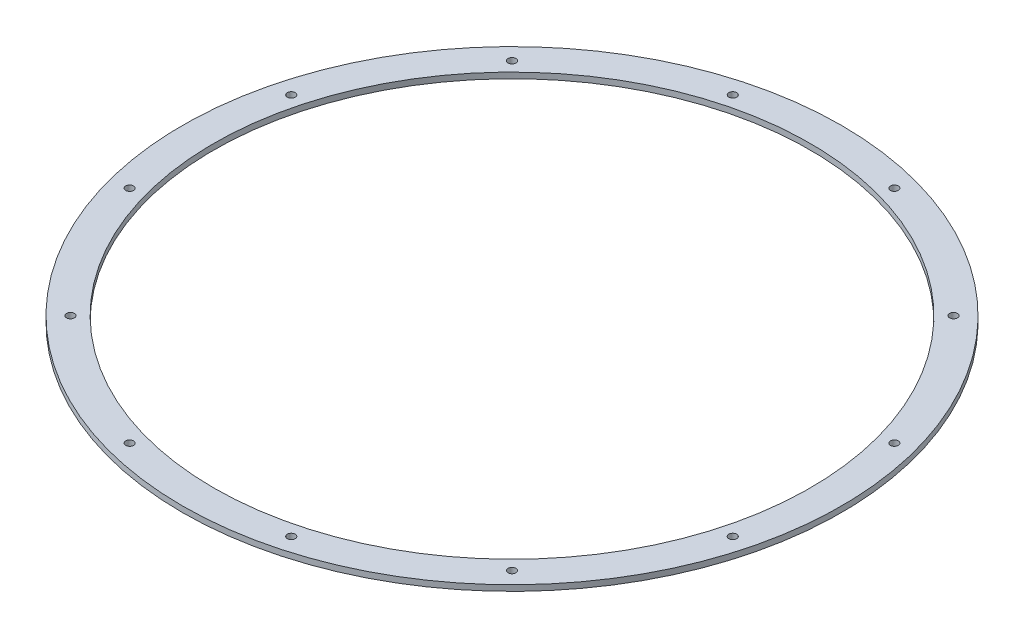
ISO-10303-21;
HEADER;
FILE_DESCRIPTION(('STEP AP214'),'2;1');
FILE_NAME('part.step','',(''),(''),'','','');
FILE_SCHEMA(('AUTOMOTIVE_DESIGN { 1 0 10303 214 1 1 1 1 }'));
ENDSEC;
DATA;
#1=APPLICATION_CONTEXT('core data for automotive mechanical design processes');
#2=APPLICATION_PROTOCOL_DEFINITION('international standard','automotive_design',2000,#1);
#3=PRODUCT_CONTEXT('',#1,'mechanical');
#4=PRODUCT('Part','Part','',(#3));
#5=PRODUCT_RELATED_PRODUCT_CATEGORY('part','',(#4));
#6=PRODUCT_DEFINITION_FORMATION('','',#4);
#7=PRODUCT_DEFINITION_CONTEXT('part definition',#1,'design');
#8=PRODUCT_DEFINITION('design','',#6,#7);
#9=PRODUCT_DEFINITION_SHAPE('','',#8);
#10=(LENGTH_UNIT() NAMED_UNIT(*) SI_UNIT(.MILLI.,.METRE.));
#11=(NAMED_UNIT(*) PLANE_ANGLE_UNIT() SI_UNIT($,.RADIAN.));
#12=(NAMED_UNIT(*) SI_UNIT($,.STERADIAN.) SOLID_ANGLE_UNIT());
#13=UNCERTAINTY_MEASURE_WITH_UNIT(LENGTH_MEASURE(1.E-05),#10,'distance_accuracy_value','');
#14=(GEOMETRIC_REPRESENTATION_CONTEXT(3) GLOBAL_UNCERTAINTY_ASSIGNED_CONTEXT((#13)) GLOBAL_UNIT_ASSIGNED_CONTEXT((#10,
#11,#12)) REPRESENTATION_CONTEXT('',''));
#15=CARTESIAN_POINT('',(0.,0.,0.));
#16=DIRECTION('',(0.,0.,1.));
#17=DIRECTION('',(1.,0.,0.));
#18=AXIS2_PLACEMENT_3D('',#15,#16,#17);
#19=CARTESIAN_POINT('',(0.,2.5,0.));
#20=DIRECTION('',(0.,1.,0.));
#21=DIRECTION('',(0.,0.,1.));
#22=AXIS2_PLACEMENT_3D('',#19,#20,#21);
#23=PLANE('',#22);
#24=CARTESIAN_POINT('',(-190.918830920357,2.5,190.918830920365));
#25=DIRECTION('',(0.,1.,0.));
#26=DIRECTION('',(0.,0.,1.));
#27=AXIS2_PLACEMENT_3D('',#24,#25,#26);
#28=CIRCLE('',#27,3.39999999999999);
#29=CARTESIAN_POINT('',(-190.918830920357,2.5,194.318830920365));
#30=VERTEX_POINT('',#29);
#31=EDGE_CURVE('E106',#30,#30,#28,.T.);
#32=ORIENTED_EDGE('',*,*,#31,.F.);
#33=EDGE_LOOP('',(#32));
#34=FACE_BOUND('',#33,.T.);
#35=CARTESIAN_POINT('',(69.8811421776947,2.5,260.799973098035));
#36=DIRECTION('',(0.,1.,0.));
#37=DIRECTION('',(0.,0.,1.));
#38=AXIS2_PLACEMENT_3D('',#35,#36,#37);
#39=CIRCLE('',#38,3.4);
#40=CARTESIAN_POINT('',(69.8811421776947,2.5,264.199973098035));
#41=VERTEX_POINT('',#40);
#42=EDGE_CURVE('E94',#41,#41,#39,.T.);
#43=ORIENTED_EDGE('',*,*,#42,.F.);
#44=EDGE_LOOP('',(#43));
#45=FACE_BOUND('',#44,.T.);
#46=CARTESIAN_POINT('',(260.799973098055,2.5,69.8811421776587));
#47=DIRECTION('',(0.,1.,0.));
#48=DIRECTION('',(0.,0.,1.));
#49=AXIS2_PLACEMENT_3D('',#46,#47,#48);
#50=CIRCLE('',#49,3.40000000000003);
#51=CARTESIAN_POINT('',(260.799973098055,2.5,73.2811421776587));
#52=VERTEX_POINT('',#51);
#53=EDGE_CURVE('E82',#52,#52,#50,.T.);
#54=ORIENTED_EDGE('',*,*,#53,.F.);
#55=EDGE_LOOP('',(#54));
#56=FACE_BOUND('',#55,.T.);
#57=CARTESIAN_POINT('',(190.918830920363,2.5,-190.918830920387));
#58=DIRECTION('',(0.,1.,0.));
#59=DIRECTION('',(0.,0.,1.));
#60=AXIS2_PLACEMENT_3D('',#57,#58,#59);
#61=CIRCLE('',#60,3.39999999999999);
#62=CARTESIAN_POINT('',(190.918830920363,2.5,-187.518830920387));
#63=VERTEX_POINT('',#62);
#64=EDGE_CURVE('E70',#63,#63,#61,.T.);
#65=ORIENTED_EDGE('',*,*,#64,.F.);
#66=EDGE_LOOP('',(#65));
#67=FACE_BOUND('',#66,.T.);
#68=CARTESIAN_POINT('',(-69.8811421776885,2.5,-260.799973098057));
#69=DIRECTION('',(0.,1.,0.));
#70=DIRECTION('',(0.,0.,1.));
#71=AXIS2_PLACEMENT_3D('',#68,#69,#70);
#72=CIRCLE('',#71,3.4);
#73=CARTESIAN_POINT('',(-69.8811421776885,2.5,-257.399973098057));
#74=VERTEX_POINT('',#73);
#75=EDGE_CURVE('E58',#74,#74,#72,.T.);
#76=ORIENTED_EDGE('',*,*,#75,.F.);
#77=EDGE_LOOP('',(#76));
#78=FACE_BOUND('',#77,.T.);
#79=CARTESIAN_POINT('',(-260.799973098048,2.5,-69.8811421776808));
#80=DIRECTION('',(0.,1.,0.));
#81=DIRECTION('',(0.,0.,1.));
#82=AXIS2_PLACEMENT_3D('',#79,#80,#81);
#83=CIRCLE('',#82,3.40000000000003);
#84=CARTESIAN_POINT('',(-260.799973098048,2.5,-66.4811421776807));
#85=VERTEX_POINT('',#84);
#86=EDGE_CURVE('E46',#85,#85,#83,.T.);
#87=ORIENTED_EDGE('',*,*,#86,.F.);
#88=EDGE_LOOP('',(#87));
#89=FACE_BOUND('',#88,.T.);
#90=CARTESIAN_POINT('',(0.,2.5,0.));
#91=DIRECTION('',(0.,1.,0.));
#92=DIRECTION('',(0.,0.,1.));
#93=AXIS2_PLACEMENT_3D('',#90,#91,#92);
#94=CIRCLE('',#93,285.);
#95=CARTESIAN_POINT('',(0.,2.5,285.));
#96=VERTEX_POINT('',#95);
#97=EDGE_CURVE('E10',#96,#96,#94,.T.);
#98=ORIENTED_EDGE('',*,*,#97,.T.);
#99=EDGE_LOOP('',(#98));
#100=FACE_BOUND('',#99,.T.);
#101=CARTESIAN_POINT('',(0.,2.5,0.));
#102=DIRECTION('',(0.,1.,0.));
#103=DIRECTION('',(0.,0.,1.));
#104=AXIS2_PLACEMENT_3D('',#101,#102,#103);
#105=CIRCLE('',#104,258.);
#106=CARTESIAN_POINT('',(0.,2.5,258.));
#107=VERTEX_POINT('',#106);
#108=EDGE_CURVE('E41',#107,#107,#105,.T.);
#109=ORIENTED_EDGE('',*,*,#108,.F.);
#110=EDGE_LOOP('',(#109));
#111=FACE_BOUND('',#110,.T.);
#112=CARTESIAN_POINT('',(-190.918830920373,2.5,-190.918830920371));
#113=DIRECTION('',(0.,1.,0.));
#114=DIRECTION('',(0.,0.,1.));
#115=AXIS2_PLACEMENT_3D('',#112,#113,#114);
#116=CIRCLE('',#115,3.39999999999999);
#117=CARTESIAN_POINT('',(-190.918830920373,2.5,-187.518830920371));
#118=VERTEX_POINT('',#117);
#119=EDGE_CURVE('E52',#118,#118,#116,.T.);
#120=ORIENTED_EDGE('',*,*,#119,.F.);
#121=EDGE_LOOP('',(#120));
#122=FACE_BOUND('',#121,.T.);
#123=CARTESIAN_POINT('',(69.8811421776728,2.5,-260.799973098063));
#124=DIRECTION('',(0.,1.,0.));
#125=DIRECTION('',(0.,0.,1.));
#126=AXIS2_PLACEMENT_3D('',#123,#124,#125);
#127=CIRCLE('',#126,3.4);
#128=CARTESIAN_POINT('',(69.8811421776728,2.5,-257.399973098063));
#129=VERTEX_POINT('',#128);
#130=EDGE_CURVE('E64',#129,#129,#127,.T.);
#131=ORIENTED_EDGE('',*,*,#130,.F.);
#132=EDGE_LOOP('',(#131));
#133=FACE_BOUND('',#132,.T.);
#134=CARTESIAN_POINT('',(260.799973098049,2.5,-69.8811421777027));
#135=DIRECTION('',(0.,1.,0.));
#136=DIRECTION('',(0.,0.,1.));
#137=AXIS2_PLACEMENT_3D('',#134,#135,#136);
#138=CIRCLE('',#137,3.40000000000003);
#139=CARTESIAN_POINT('',(260.799973098049,2.5,-66.4811421777027));
#140=VERTEX_POINT('',#139);
#141=EDGE_CURVE('E76',#140,#140,#138,.T.);
#142=ORIENTED_EDGE('',*,*,#141,.F.);
#143=EDGE_LOOP('',(#142));
#144=FACE_BOUND('',#143,.T.);
#145=CARTESIAN_POINT('',(190.918830920379,2.5,190.918830920349));
#146=DIRECTION('',(0.,1.,0.));
#147=DIRECTION('',(0.,0.,1.));
#148=AXIS2_PLACEMENT_3D('',#145,#146,#147);
#149=CIRCLE('',#148,3.39999999999999);
#150=CARTESIAN_POINT('',(190.918830920379,2.5,194.318830920349));
#151=VERTEX_POINT('',#150);
#152=EDGE_CURVE('E88',#151,#151,#149,.T.);
#153=ORIENTED_EDGE('',*,*,#152,.F.);
#154=EDGE_LOOP('',(#153));
#155=FACE_BOUND('',#154,.T.);
#156=CARTESIAN_POINT('',(-69.8811421776666,2.5,260.79997309804));
#157=DIRECTION('',(0.,1.,0.));
#158=DIRECTION('',(0.,0.,1.));
#159=AXIS2_PLACEMENT_3D('',#156,#157,#158);
#160=CIRCLE('',#159,3.4);
#161=CARTESIAN_POINT('',(-69.8811421776666,2.5,264.19997309804));
#162=VERTEX_POINT('',#161);
#163=EDGE_CURVE('E100',#162,#162,#160,.T.);
#164=ORIENTED_EDGE('',*,*,#163,.F.);
#165=EDGE_LOOP('',(#164));
#166=FACE_BOUND('',#165,.T.);
#167=CARTESIAN_POINT('',(-260.799973098042,2.5,69.8811421776806));
#168=DIRECTION('',(0.,1.,0.));
#169=DIRECTION('',(0.,0.,1.));
#170=AXIS2_PLACEMENT_3D('',#167,#168,#169);
#171=CIRCLE('',#170,3.40000000000003);
#172=CARTESIAN_POINT('',(-260.799973098042,2.5,73.2811421776807));
#173=VERTEX_POINT('',#172);
#174=EDGE_CURVE('E112',#173,#173,#171,.T.);
#175=ORIENTED_EDGE('',*,*,#174,.F.);
#176=EDGE_LOOP('',(#175));
#177=FACE_BOUND('',#176,.T.);
#178=ADVANCED_FACE('F30',(#34,#45,#56,#67,#78,#89,#100,#111,#122,#133,#144,#155,#166,#177),#23,.T.);
#179=CARTESIAN_POINT('',(0.,-2.5,0.));
#180=DIRECTION('',(0.,1.,0.));
#181=DIRECTION('',(0.,0.,1.));
#182=AXIS2_PLACEMENT_3D('',#179,#180,#181);
#183=PLANE('',#182);
#184=CARTESIAN_POINT('',(0.,-2.5,0.));
#185=DIRECTION('',(0.,1.,0.));
#186=DIRECTION('',(0.,0.,1.));
#187=AXIS2_PLACEMENT_3D('',#184,#185,#186);
#188=CIRCLE('',#187,285.);
#189=CARTESIAN_POINT('',(0.,-2.5,285.));
#190=VERTEX_POINT('',#189);
#191=EDGE_CURVE('E34',#190,#190,#188,.T.);
#192=ORIENTED_EDGE('',*,*,#191,.F.);
#193=EDGE_LOOP('',(#192));
#194=FACE_BOUND('',#193,.T.);
#195=CARTESIAN_POINT('',(0.,-2.5,0.));
#196=DIRECTION('',(0.,1.,0.));
#197=DIRECTION('',(0.,0.,1.));
#198=AXIS2_PLACEMENT_3D('',#195,#196,#197);
#199=CIRCLE('',#198,258.);
#200=CARTESIAN_POINT('',(0.,-2.5,258.));
#201=VERTEX_POINT('',#200);
#202=EDGE_CURVE('E43',#201,#201,#199,.T.);
#203=ORIENTED_EDGE('',*,*,#202,.T.);
#204=EDGE_LOOP('',(#203));
#205=FACE_BOUND('',#204,.T.);
#206=CARTESIAN_POINT('',(-260.799973098048,-2.5,-69.8811421776808));
#207=DIRECTION('',(0.,1.,0.));
#208=DIRECTION('',(0.,0.,1.));
#209=AXIS2_PLACEMENT_3D('',#206,#207,#208);
#210=CIRCLE('',#209,3.40000000000003);
#211=CARTESIAN_POINT('',(-260.799973098048,-2.5,-66.4811421776807));
#212=VERTEX_POINT('',#211);
#213=EDGE_CURVE('E49',#212,#212,#210,.T.);
#214=ORIENTED_EDGE('',*,*,#213,.T.);
#215=EDGE_LOOP('',(#214));
#216=FACE_BOUND('',#215,.T.);
#217=CARTESIAN_POINT('',(-190.918830920373,-2.5,-190.918830920371));
#218=DIRECTION('',(0.,1.,0.));
#219=DIRECTION('',(0.,0.,1.));
#220=AXIS2_PLACEMENT_3D('',#217,#218,#219);
#221=CIRCLE('',#220,3.39999999999999);
#222=CARTESIAN_POINT('',(-190.918830920373,-2.5,-187.518830920371));
#223=VERTEX_POINT('',#222);
#224=EDGE_CURVE('E55',#223,#223,#221,.T.);
#225=ORIENTED_EDGE('',*,*,#224,.T.);
#226=EDGE_LOOP('',(#225));
#227=FACE_BOUND('',#226,.T.);
#228=CARTESIAN_POINT('',(-69.8811421776885,-2.5,-260.799973098057));
#229=DIRECTION('',(0.,1.,0.));
#230=DIRECTION('',(0.,0.,1.));
#231=AXIS2_PLACEMENT_3D('',#228,#229,#230);
#232=CIRCLE('',#231,3.4);
#233=CARTESIAN_POINT('',(-69.8811421776885,-2.5,-257.399973098057));
#234=VERTEX_POINT('',#233);
#235=EDGE_CURVE('E61',#234,#234,#232,.T.);
#236=ORIENTED_EDGE('',*,*,#235,.T.);
#237=EDGE_LOOP('',(#236));
#238=FACE_BOUND('',#237,.T.);
#239=CARTESIAN_POINT('',(69.8811421776728,-2.5,-260.799973098063));
#240=DIRECTION('',(0.,1.,0.));
#241=DIRECTION('',(0.,0.,1.));
#242=AXIS2_PLACEMENT_3D('',#239,#240,#241);
#243=CIRCLE('',#242,3.4);
#244=CARTESIAN_POINT('',(69.8811421776728,-2.5,-257.399973098063));
#245=VERTEX_POINT('',#244);
#246=EDGE_CURVE('E67',#245,#245,#243,.T.);
#247=ORIENTED_EDGE('',*,*,#246,.T.);
#248=EDGE_LOOP('',(#247));
#249=FACE_BOUND('',#248,.T.);
#250=CARTESIAN_POINT('',(190.918830920363,-2.5,-190.918830920387));
#251=DIRECTION('',(0.,1.,0.));
#252=DIRECTION('',(0.,0.,1.));
#253=AXIS2_PLACEMENT_3D('',#250,#251,#252);
#254=CIRCLE('',#253,3.39999999999999);
#255=CARTESIAN_POINT('',(190.918830920363,-2.5,-187.518830920387));
#256=VERTEX_POINT('',#255);
#257=EDGE_CURVE('E73',#256,#256,#254,.T.);
#258=ORIENTED_EDGE('',*,*,#257,.T.);
#259=EDGE_LOOP('',(#258));
#260=FACE_BOUND('',#259,.T.);
#261=CARTESIAN_POINT('',(260.799973098049,-2.5,-69.8811421777027));
#262=DIRECTION('',(0.,1.,0.));
#263=DIRECTION('',(0.,0.,1.));
#264=AXIS2_PLACEMENT_3D('',#261,#262,#263);
#265=CIRCLE('',#264,3.40000000000003);
#266=CARTESIAN_POINT('',(260.799973098049,-2.5,-66.4811421777027));
#267=VERTEX_POINT('',#266);
#268=EDGE_CURVE('E79',#267,#267,#265,.T.);
#269=ORIENTED_EDGE('',*,*,#268,.T.);
#270=EDGE_LOOP('',(#269));
#271=FACE_BOUND('',#270,.T.);
#272=CARTESIAN_POINT('',(260.799973098055,-2.5,69.8811421776587));
#273=DIRECTION('',(0.,1.,0.));
#274=DIRECTION('',(0.,0.,1.));
#275=AXIS2_PLACEMENT_3D('',#272,#273,#274);
#276=CIRCLE('',#275,3.40000000000003);
#277=CARTESIAN_POINT('',(260.799973098055,-2.5,73.2811421776587));
#278=VERTEX_POINT('',#277);
#279=EDGE_CURVE('E85',#278,#278,#276,.T.);
#280=ORIENTED_EDGE('',*,*,#279,.T.);
#281=EDGE_LOOP('',(#280));
#282=FACE_BOUND('',#281,.T.);
#283=CARTESIAN_POINT('',(190.918830920379,-2.5,190.918830920349));
#284=DIRECTION('',(0.,1.,0.));
#285=DIRECTION('',(0.,0.,1.));
#286=AXIS2_PLACEMENT_3D('',#283,#284,#285);
#287=CIRCLE('',#286,3.39999999999999);
#288=CARTESIAN_POINT('',(190.918830920379,-2.5,194.318830920349));
#289=VERTEX_POINT('',#288);
#290=EDGE_CURVE('E91',#289,#289,#287,.T.);
#291=ORIENTED_EDGE('',*,*,#290,.T.);
#292=EDGE_LOOP('',(#291));
#293=FACE_BOUND('',#292,.T.);
#294=CARTESIAN_POINT('',(69.8811421776947,-2.5,260.799973098035));
#295=DIRECTION('',(0.,1.,0.));
#296=DIRECTION('',(0.,0.,1.));
#297=AXIS2_PLACEMENT_3D('',#294,#295,#296);
#298=CIRCLE('',#297,3.4);
#299=CARTESIAN_POINT('',(69.8811421776947,-2.5,264.199973098035));
#300=VERTEX_POINT('',#299);
#301=EDGE_CURVE('E97',#300,#300,#298,.T.);
#302=ORIENTED_EDGE('',*,*,#301,.T.);
#303=EDGE_LOOP('',(#302));
#304=FACE_BOUND('',#303,.T.);
#305=CARTESIAN_POINT('',(-69.8811421776666,-2.5,260.79997309804));
#306=DIRECTION('',(0.,1.,0.));
#307=DIRECTION('',(0.,0.,1.));
#308=AXIS2_PLACEMENT_3D('',#305,#306,#307);
#309=CIRCLE('',#308,3.4);
#310=CARTESIAN_POINT('',(-69.8811421776666,-2.5,264.19997309804));
#311=VERTEX_POINT('',#310);
#312=EDGE_CURVE('E103',#311,#311,#309,.T.);
#313=ORIENTED_EDGE('',*,*,#312,.T.);
#314=EDGE_LOOP('',(#313));
#315=FACE_BOUND('',#314,.T.);
#316=CARTESIAN_POINT('',(-190.918830920357,-2.5,190.918830920365));
#317=DIRECTION('',(0.,1.,0.));
#318=DIRECTION('',(0.,0.,1.));
#319=AXIS2_PLACEMENT_3D('',#316,#317,#318);
#320=CIRCLE('',#319,3.39999999999999);
#321=CARTESIAN_POINT('',(-190.918830920357,-2.5,194.318830920365));
#322=VERTEX_POINT('',#321);
#323=EDGE_CURVE('E109',#322,#322,#320,.T.);
#324=ORIENTED_EDGE('',*,*,#323,.T.);
#325=EDGE_LOOP('',(#324));
#326=FACE_BOUND('',#325,.T.);
#327=CARTESIAN_POINT('',(-260.799973098042,-2.5,69.8811421776806));
#328=DIRECTION('',(0.,1.,0.));
#329=DIRECTION('',(0.,0.,1.));
#330=AXIS2_PLACEMENT_3D('',#327,#328,#329);
#331=CIRCLE('',#330,3.40000000000003);
#332=CARTESIAN_POINT('',(-260.799973098042,-2.5,73.2811421776807));
#333=VERTEX_POINT('',#332);
#334=EDGE_CURVE('E115',#333,#333,#331,.T.);
#335=ORIENTED_EDGE('',*,*,#334,.T.);
#336=EDGE_LOOP('',(#335));
#337=FACE_BOUND('',#336,.T.);
#338=ADVANCED_FACE('F125',(#194,#205,#216,#227,#238,#249,#260,#271,#282,#293,#304,#315,#326,
#337),#183,.F.);
#339=CARTESIAN_POINT('',(0.,2.5,0.));
#340=DIRECTION('',(0.,-1.,0.));
#341=DIRECTION('',(0.,0.,-1.));
#342=AXIS2_PLACEMENT_3D('',#339,#340,#341);
#343=CYLINDRICAL_SURFACE('',#342,285.);
#344=ORIENTED_EDGE('',*,*,#191,.T.);
#345=EDGE_LOOP('',(#344));
#346=FACE_BOUND('',#345,.T.);
#347=ORIENTED_EDGE('',*,*,#97,.F.);
#348=EDGE_LOOP('',(#347));
#349=FACE_BOUND('',#348,.T.);
#350=ADVANCED_FACE('F32',(#346,#349),#343,.T.);
#351=CARTESIAN_POINT('',(0.,2.5,0.));
#352=DIRECTION('',(0.,-1.,0.));
#353=DIRECTION('',(0.,0.,-1.));
#354=AXIS2_PLACEMENT_3D('',#351,#352,#353);
#355=CYLINDRICAL_SURFACE('',#354,258.);
#356=ORIENTED_EDGE('',*,*,#108,.T.);
#357=EDGE_LOOP('',(#356));
#358=FACE_BOUND('',#357,.T.);
#359=ORIENTED_EDGE('',*,*,#202,.F.);
#360=EDGE_LOOP('',(#359));
#361=FACE_BOUND('',#360,.T.);
#362=ADVANCED_FACE('F135',(#358,#361),#355,.F.);
#363=CARTESIAN_POINT('',(-260.799973098048,2.5,-69.8811421776808));
#364=DIRECTION('',(0.,-1.,0.));
#365=DIRECTION('',(0.,0.,-1.));
#366=AXIS2_PLACEMENT_3D('',#363,#364,#365);
#367=CYLINDRICAL_SURFACE('',#366,3.40000000000003);
#368=ORIENTED_EDGE('',*,*,#86,.T.);
#369=EDGE_LOOP('',(#368));
#370=FACE_BOUND('',#369,.T.);
#371=ORIENTED_EDGE('',*,*,#213,.F.);
#372=EDGE_LOOP('',(#371));
#373=FACE_BOUND('',#372,.T.);
#374=ADVANCED_FACE('F138',(#370,#373),#367,.F.);
#375=CARTESIAN_POINT('',(-190.918830920373,2.5,-190.918830920371));
#376=DIRECTION('',(0.,-1.,0.));
#377=DIRECTION('',(0.,0.,-1.));
#378=AXIS2_PLACEMENT_3D('',#375,#376,#377);
#379=CYLINDRICAL_SURFACE('',#378,3.39999999999999);
#380=ORIENTED_EDGE('',*,*,#119,.T.);
#381=EDGE_LOOP('',(#380));
#382=FACE_BOUND('',#381,.T.);
#383=ORIENTED_EDGE('',*,*,#224,.F.);
#384=EDGE_LOOP('',(#383));
#385=FACE_BOUND('',#384,.T.);
#386=ADVANCED_FACE('F142',(#382,#385),#379,.F.);
#387=CARTESIAN_POINT('',(-69.8811421776885,2.5,-260.799973098057));
#388=DIRECTION('',(0.,-1.,0.));
#389=DIRECTION('',(0.,0.,-1.));
#390=AXIS2_PLACEMENT_3D('',#387,#388,#389);
#391=CYLINDRICAL_SURFACE('',#390,3.4);
#392=ORIENTED_EDGE('',*,*,#75,.T.);
#393=EDGE_LOOP('',(#392));
#394=FACE_BOUND('',#393,.T.);
#395=ORIENTED_EDGE('',*,*,#235,.F.);
#396=EDGE_LOOP('',(#395));
#397=FACE_BOUND('',#396,.T.);
#398=ADVANCED_FACE('F146',(#394,#397),#391,.F.);
#399=CARTESIAN_POINT('',(69.8811421776728,2.5,-260.799973098063));
#400=DIRECTION('',(0.,-1.,0.));
#401=DIRECTION('',(0.,0.,-1.));
#402=AXIS2_PLACEMENT_3D('',#399,#400,#401);
#403=CYLINDRICAL_SURFACE('',#402,3.4);
#404=ORIENTED_EDGE('',*,*,#130,.T.);
#405=EDGE_LOOP('',(#404));
#406=FACE_BOUND('',#405,.T.);
#407=ORIENTED_EDGE('',*,*,#246,.F.);
#408=EDGE_LOOP('',(#407));
#409=FACE_BOUND('',#408,.T.);
#410=ADVANCED_FACE('F150',(#406,#409),#403,.F.);
#411=CARTESIAN_POINT('',(190.918830920363,2.5,-190.918830920387));
#412=DIRECTION('',(0.,-1.,0.));
#413=DIRECTION('',(0.,0.,-1.));
#414=AXIS2_PLACEMENT_3D('',#411,#412,#413);
#415=CYLINDRICAL_SURFACE('',#414,3.39999999999999);
#416=ORIENTED_EDGE('',*,*,#64,.T.);
#417=EDGE_LOOP('',(#416));
#418=FACE_BOUND('',#417,.T.);
#419=ORIENTED_EDGE('',*,*,#257,.F.);
#420=EDGE_LOOP('',(#419));
#421=FACE_BOUND('',#420,.T.);
#422=ADVANCED_FACE('F154',(#418,#421),#415,.F.);
#423=CARTESIAN_POINT('',(260.799973098049,2.5,-69.8811421777027));
#424=DIRECTION('',(0.,-1.,0.));
#425=DIRECTION('',(0.,0.,-1.));
#426=AXIS2_PLACEMENT_3D('',#423,#424,#425);
#427=CYLINDRICAL_SURFACE('',#426,3.40000000000003);
#428=ORIENTED_EDGE('',*,*,#141,.T.);
#429=EDGE_LOOP('',(#428));
#430=FACE_BOUND('',#429,.T.);
#431=ORIENTED_EDGE('',*,*,#268,.F.);
#432=EDGE_LOOP('',(#431));
#433=FACE_BOUND('',#432,.T.);
#434=ADVANCED_FACE('F158',(#430,#433),#427,.F.);
#435=CARTESIAN_POINT('',(260.799973098055,2.5,69.8811421776587));
#436=DIRECTION('',(0.,-1.,0.));
#437=DIRECTION('',(0.,0.,-1.));
#438=AXIS2_PLACEMENT_3D('',#435,#436,#437);
#439=CYLINDRICAL_SURFACE('',#438,3.40000000000003);
#440=ORIENTED_EDGE('',*,*,#53,.T.);
#441=EDGE_LOOP('',(#440));
#442=FACE_BOUND('',#441,.T.);
#443=ORIENTED_EDGE('',*,*,#279,.F.);
#444=EDGE_LOOP('',(#443));
#445=FACE_BOUND('',#444,.T.);
#446=ADVANCED_FACE('F162',(#442,#445),#439,.F.);
#447=CARTESIAN_POINT('',(190.918830920379,2.5,190.918830920349));
#448=DIRECTION('',(0.,-1.,0.));
#449=DIRECTION('',(0.,0.,-1.));
#450=AXIS2_PLACEMENT_3D('',#447,#448,#449);
#451=CYLINDRICAL_SURFACE('',#450,3.39999999999999);
#452=ORIENTED_EDGE('',*,*,#152,.T.);
#453=EDGE_LOOP('',(#452));
#454=FACE_BOUND('',#453,.T.);
#455=ORIENTED_EDGE('',*,*,#290,.F.);
#456=EDGE_LOOP('',(#455));
#457=FACE_BOUND('',#456,.T.);
#458=ADVANCED_FACE('F166',(#454,#457),#451,.F.);
#459=CARTESIAN_POINT('',(69.8811421776947,2.5,260.799973098035));
#460=DIRECTION('',(0.,-1.,0.));
#461=DIRECTION('',(0.,0.,-1.));
#462=AXIS2_PLACEMENT_3D('',#459,#460,#461);
#463=CYLINDRICAL_SURFACE('',#462,3.4);
#464=ORIENTED_EDGE('',*,*,#42,.T.);
#465=EDGE_LOOP('',(#464));
#466=FACE_BOUND('',#465,.T.);
#467=ORIENTED_EDGE('',*,*,#301,.F.);
#468=EDGE_LOOP('',(#467));
#469=FACE_BOUND('',#468,.T.);
#470=ADVANCED_FACE('F170',(#466,#469),#463,.F.);
#471=CARTESIAN_POINT('',(-69.8811421776666,2.5,260.79997309804));
#472=DIRECTION('',(0.,-1.,0.));
#473=DIRECTION('',(0.,0.,-1.));
#474=AXIS2_PLACEMENT_3D('',#471,#472,#473);
#475=CYLINDRICAL_SURFACE('',#474,3.4);
#476=ORIENTED_EDGE('',*,*,#163,.T.);
#477=EDGE_LOOP('',(#476));
#478=FACE_BOUND('',#477,.T.);
#479=ORIENTED_EDGE('',*,*,#312,.F.);
#480=EDGE_LOOP('',(#479));
#481=FACE_BOUND('',#480,.T.);
#482=ADVANCED_FACE('F174',(#478,#481),#475,.F.);
#483=CARTESIAN_POINT('',(-190.918830920357,2.5,190.918830920365));
#484=DIRECTION('',(0.,-1.,0.));
#485=DIRECTION('',(0.,0.,-1.));
#486=AXIS2_PLACEMENT_3D('',#483,#484,#485);
#487=CYLINDRICAL_SURFACE('',#486,3.39999999999999);
#488=ORIENTED_EDGE('',*,*,#31,.T.);
#489=EDGE_LOOP('',(#488));
#490=FACE_BOUND('',#489,.T.);
#491=ORIENTED_EDGE('',*,*,#323,.F.);
#492=EDGE_LOOP('',(#491));
#493=FACE_BOUND('',#492,.T.);
#494=ADVANCED_FACE('F178',(#490,#493),#487,.F.);
#495=CARTESIAN_POINT('',(-260.799973098042,2.5,69.8811421776806));
#496=DIRECTION('',(0.,-1.,0.));
#497=DIRECTION('',(0.,0.,-1.));
#498=AXIS2_PLACEMENT_3D('',#495,#496,#497);
#499=CYLINDRICAL_SURFACE('',#498,3.40000000000003);
#500=ORIENTED_EDGE('',*,*,#174,.T.);
#501=EDGE_LOOP('',(#500));
#502=FACE_BOUND('',#501,.T.);
#503=ORIENTED_EDGE('',*,*,#334,.F.);
#504=EDGE_LOOP('',(#503));
#505=FACE_BOUND('',#504,.T.);
#506=ADVANCED_FACE('F121',(#502,#505),#499,.F.);
#507=CLOSED_SHELL('',(#178,#338,#350,#362,#374,#386,#398,#410,#422,#434,#446,#458,#470,#482,
#494,#506));
#508=MANIFOLD_SOLID_BREP('B2',#507);
#509=ADVANCED_BREP_SHAPE_REPRESENTATION('',(#18,#508),#14);
#510=SHAPE_DEFINITION_REPRESENTATION(#9,#509);
ENDSEC;
END-ISO-10303-21;
